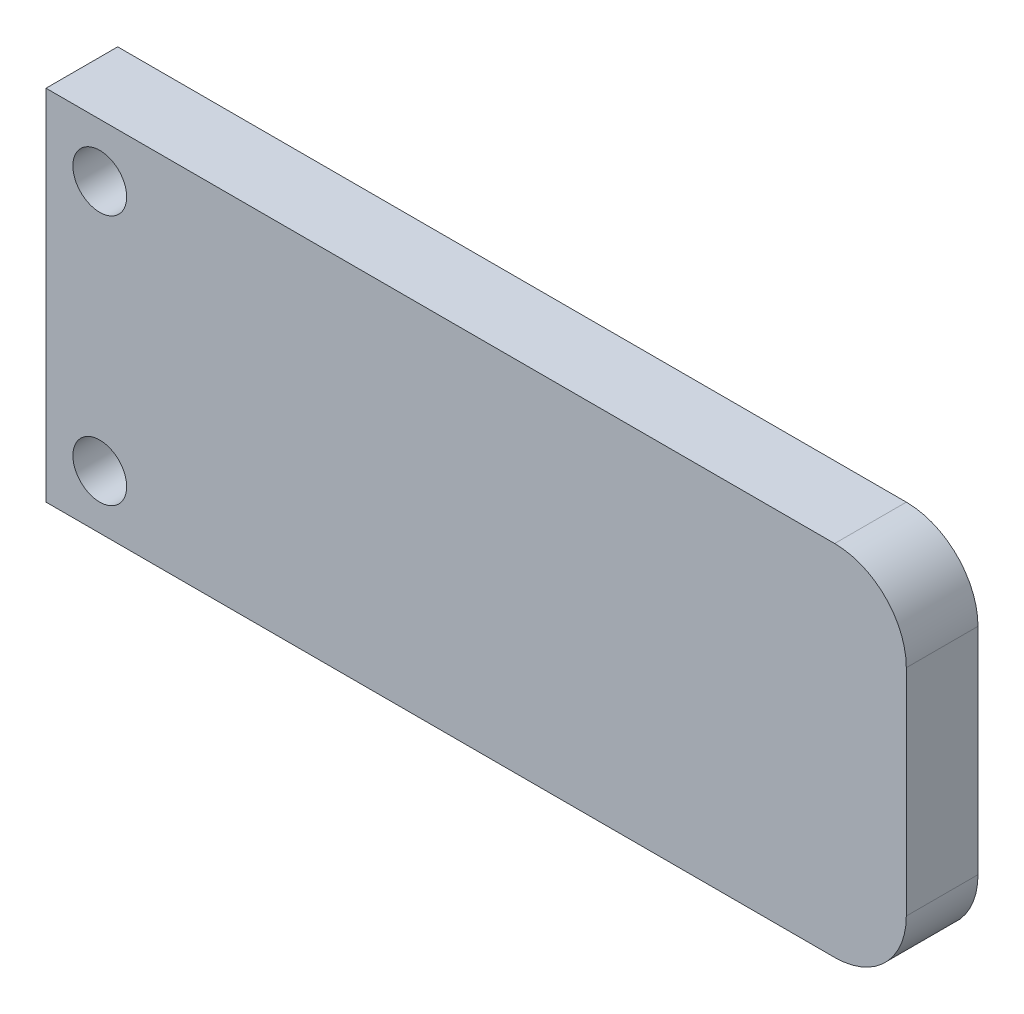
ISO-10303-21;
HEADER;
FILE_DESCRIPTION(('STEP AP214'),'2;1');
FILE_NAME('part.step','',(''),(''),'','','');
FILE_SCHEMA(('AUTOMOTIVE_DESIGN { 1 0 10303 214 1 1 1 1 }'));
ENDSEC;
DATA;
#1=APPLICATION_CONTEXT('core data for automotive mechanical design processes');
#2=APPLICATION_PROTOCOL_DEFINITION('international standard','automotive_design',2000,#1);
#3=PRODUCT_CONTEXT('',#1,'mechanical');
#4=PRODUCT('Part','Part','',(#3));
#5=PRODUCT_RELATED_PRODUCT_CATEGORY('part','',(#4));
#6=PRODUCT_DEFINITION_FORMATION('','',#4);
#7=PRODUCT_DEFINITION_CONTEXT('part definition',#1,'design');
#8=PRODUCT_DEFINITION('design','',#6,#7);
#9=PRODUCT_DEFINITION_SHAPE('','',#8);
#10=(LENGTH_UNIT() NAMED_UNIT(*) SI_UNIT(.MILLI.,.METRE.));
#11=(NAMED_UNIT(*) PLANE_ANGLE_UNIT() SI_UNIT($,.RADIAN.));
#12=(NAMED_UNIT(*) SI_UNIT($,.STERADIAN.) SOLID_ANGLE_UNIT());
#13=UNCERTAINTY_MEASURE_WITH_UNIT(LENGTH_MEASURE(1.E-05),#10,'distance_accuracy_value','');
#14=(GEOMETRIC_REPRESENTATION_CONTEXT(3) GLOBAL_UNCERTAINTY_ASSIGNED_CONTEXT((#13)) GLOBAL_UNIT_ASSIGNED_CONTEXT((#10,
#11,#12)) REPRESENTATION_CONTEXT('',''));
#15=CARTESIAN_POINT('',(0.,0.,0.));
#16=DIRECTION('',(0.,0.,1.));
#17=DIRECTION('',(1.,0.,0.));
#18=AXIS2_PLACEMENT_3D('',#15,#16,#17);
#19=CARTESIAN_POINT('',(24.,-10.,2.));
#20=DIRECTION('',(-1.,0.,0.));
#21=DIRECTION('',(0.,0.,1.));
#22=AXIS2_PLACEMENT_3D('',#19,#20,#21);
#23=PLANE('',#22);
#24=DIRECTION('',(0.,1.,0.));
#25=VECTOR('',#24,1.);
#26=CARTESIAN_POINT('',(24.,-10.,2.));
#27=LINE('',#26,#25);
#28=CARTESIAN_POINT('',(24.,-6.,2.));
#29=VERTEX_POINT('',#28);
#30=CARTESIAN_POINT('',(24.,6.,2.));
#31=VERTEX_POINT('',#30);
#32=EDGE_CURVE('E106',#29,#31,#27,.T.);
#33=ORIENTED_EDGE('',*,*,#32,.F.);
#34=DIRECTION('',(0.,0.,-1.));
#35=VECTOR('',#34,1.);
#36=CARTESIAN_POINT('',(24.,-6.,2.));
#37=LINE('',#36,#35);
#38=CARTESIAN_POINT('',(24.,-6.,-2.));
#39=VERTEX_POINT('',#38);
#40=EDGE_CURVE('E136',#29,#39,#37,.T.);
#41=ORIENTED_EDGE('',*,*,#40,.T.);
#42=DIRECTION('',(0.,1.,0.));
#43=VECTOR('',#42,1.);
#44=CARTESIAN_POINT('',(24.,-10.,-2.));
#45=LINE('',#44,#43);
#46=CARTESIAN_POINT('',(24.,6.,-2.));
#47=VERTEX_POINT('',#46);
#48=EDGE_CURVE('E125',#39,#47,#45,.T.);
#49=ORIENTED_EDGE('',*,*,#48,.T.);
#50=DIRECTION('',(0.,0.,-1.));
#51=VECTOR('',#50,1.);
#52=CARTESIAN_POINT('',(24.,6.,2.));
#53=LINE('',#52,#51);
#54=EDGE_CURVE('E115',#47,#31,#53,.F.);
#55=ORIENTED_EDGE('',*,*,#54,.T.);
#56=EDGE_LOOP('',(#33,#41,#49,#55));
#57=FACE_BOUND('',#56,.T.);
#58=ADVANCED_FACE('F45',(#57),#23,.F.);
#59=CARTESIAN_POINT('',(-24.,10.,2.));
#60=DIRECTION('',(0.,-1.,0.));
#61=DIRECTION('',(0.,0.,-1.));
#62=AXIS2_PLACEMENT_3D('',#59,#60,#61);
#63=PLANE('',#62);
#64=DIRECTION('',(-1.,0.,0.));
#65=VECTOR('',#64,1.);
#66=CARTESIAN_POINT('',(-24.,10.,2.));
#67=LINE('',#66,#65);
#68=CARTESIAN_POINT('',(20.,10.,2.));
#69=VERTEX_POINT('',#68);
#70=CARTESIAN_POINT('',(-24.,10.,2.));
#71=VERTEX_POINT('',#70);
#72=EDGE_CURVE('E98',#69,#71,#67,.T.);
#73=ORIENTED_EDGE('',*,*,#72,.F.);
#74=DIRECTION('',(0.,0.,-1.));
#75=VECTOR('',#74,1.);
#76=CARTESIAN_POINT('',(20.,10.,2.));
#77=LINE('',#76,#75);
#78=CARTESIAN_POINT('',(20.,10.,-2.));
#79=VERTEX_POINT('',#78);
#80=EDGE_CURVE('E11',#69,#79,#77,.T.);
#81=ORIENTED_EDGE('',*,*,#80,.T.);
#82=DIRECTION('',(-1.,0.,0.));
#83=VECTOR('',#82,1.);
#84=CARTESIAN_POINT('',(-24.,10.,-2.));
#85=LINE('',#84,#83);
#86=CARTESIAN_POINT('',(-24.,10.,-2.));
#87=VERTEX_POINT('',#86);
#88=EDGE_CURVE('E112',#79,#87,#85,.T.);
#89=ORIENTED_EDGE('',*,*,#88,.T.);
#90=DIRECTION('',(0.,0.,-1.));
#91=VECTOR('',#90,1.);
#92=CARTESIAN_POINT('',(-24.,10.,2.));
#93=LINE('',#92,#91);
#94=EDGE_CURVE('E109',#71,#87,#93,.T.);
#95=ORIENTED_EDGE('',*,*,#94,.F.);
#96=EDGE_LOOP('',(#73,#81,#89,#95));
#97=FACE_BOUND('',#96,.T.);
#98=ADVANCED_FACE('F110',(#97),#63,.F.);
#99=CARTESIAN_POINT('',(-24.,-10.,2.));
#100=DIRECTION('',(1.,0.,0.));
#101=DIRECTION('',(0.,0.,-1.));
#102=AXIS2_PLACEMENT_3D('',#99,#100,#101);
#103=PLANE('',#102);
#104=DIRECTION('',(0.,-1.,0.));
#105=VECTOR('',#104,1.);
#106=CARTESIAN_POINT('',(-24.,-10.,-2.));
#107=LINE('',#106,#105);
#108=CARTESIAN_POINT('',(-24.,-10.,-2.));
#109=VERTEX_POINT('',#108);
#110=EDGE_CURVE('E130',#87,#109,#107,.T.);
#111=ORIENTED_EDGE('',*,*,#110,.T.);
#112=DIRECTION('',(0.,0.,-1.));
#113=VECTOR('',#112,1.);
#114=CARTESIAN_POINT('',(-24.,-10.,2.));
#115=LINE('',#114,#113);
#116=CARTESIAN_POINT('',(-24.,-10.,2.));
#117=VERTEX_POINT('',#116);
#118=EDGE_CURVE('E116',#117,#109,#115,.T.);
#119=ORIENTED_EDGE('',*,*,#118,.F.);
#120=DIRECTION('',(0.,-1.,0.));
#121=VECTOR('',#120,1.);
#122=CARTESIAN_POINT('',(-24.,-10.,2.));
#123=LINE('',#122,#121);
#124=EDGE_CURVE('E102',#71,#117,#123,.T.);
#125=ORIENTED_EDGE('',*,*,#124,.F.);
#126=ORIENTED_EDGE('',*,*,#94,.T.);
#127=EDGE_LOOP('',(#111,#119,#125,#126));
#128=FACE_BOUND('',#127,.T.);
#129=ADVANCED_FACE('F118',(#128),#103,.F.);
#130=CARTESIAN_POINT('',(-24.,-10.,2.));
#131=DIRECTION('',(0.,1.,0.));
#132=DIRECTION('',(0.,0.,1.));
#133=AXIS2_PLACEMENT_3D('',#130,#131,#132);
#134=PLANE('',#133);
#135=DIRECTION('',(1.,0.,0.));
#136=VECTOR('',#135,1.);
#137=CARTESIAN_POINT('',(-24.,-10.,-2.));
#138=LINE('',#137,#136);
#139=CARTESIAN_POINT('',(20.,-10.,-2.));
#140=VERTEX_POINT('',#139);
#141=EDGE_CURVE('E132',#109,#140,#138,.T.);
#142=ORIENTED_EDGE('',*,*,#141,.T.);
#143=DIRECTION('',(0.,0.,-1.));
#144=VECTOR('',#143,1.);
#145=CARTESIAN_POINT('',(20.,-10.,2.));
#146=LINE('',#145,#144);
#147=CARTESIAN_POINT('',(20.,-10.,2.));
#148=VERTEX_POINT('',#147);
#149=EDGE_CURVE('E68',#140,#148,#146,.F.);
#150=ORIENTED_EDGE('',*,*,#149,.T.);
#151=DIRECTION('',(1.,0.,0.));
#152=VECTOR('',#151,1.);
#153=CARTESIAN_POINT('',(-24.,-10.,2.));
#154=LINE('',#153,#152);
#155=EDGE_CURVE('E120',#117,#148,#154,.T.);
#156=ORIENTED_EDGE('',*,*,#155,.F.);
#157=ORIENTED_EDGE('',*,*,#118,.T.);
#158=EDGE_LOOP('',(#142,#150,#156,#157));
#159=FACE_BOUND('',#158,.T.);
#160=ADVANCED_FACE('F155',(#159),#134,.F.);
#161=CARTESIAN_POINT('',(0.,0.,2.));
#162=DIRECTION('',(0.,0.,-1.));
#163=DIRECTION('',(-1.,0.,0.));
#164=AXIS2_PLACEMENT_3D('',#161,#162,#163);
#165=PLANE('',#164);
#166=CARTESIAN_POINT('',(-21.,7.,2.));
#167=DIRECTION('',(0.,0.,-1.));
#168=DIRECTION('',(-1.,0.,0.));
#169=AXIS2_PLACEMENT_3D('',#166,#167,#168);
#170=CIRCLE('',#169,1.5);
#171=CARTESIAN_POINT('',(-22.5,7.,2.));
#172=VERTEX_POINT('',#171);
#173=EDGE_CURVE('E128',#172,#172,#170,.F.);
#174=ORIENTED_EDGE('',*,*,#173,.F.);
#175=EDGE_LOOP('',(#174));
#176=FACE_BOUND('',#175,.T.);
#177=CARTESIAN_POINT('',(-21.,-7.,2.));
#178=DIRECTION('',(0.,0.,-1.));
#179=DIRECTION('',(-1.,0.,0.));
#180=AXIS2_PLACEMENT_3D('',#177,#178,#179);
#181=CIRCLE('',#180,1.5);
#182=CARTESIAN_POINT('',(-22.5,-7.,2.));
#183=VERTEX_POINT('',#182);
#184=EDGE_CURVE('E199',#183,#183,#181,.F.);
#185=ORIENTED_EDGE('',*,*,#184,.F.);
#186=EDGE_LOOP('',(#185));
#187=FACE_BOUND('',#186,.T.);
#188=ORIENTED_EDGE('',*,*,#155,.T.);
#189=CARTESIAN_POINT('',(20.,-6.,2.));
#190=DIRECTION('',(0.,0.,-1.));
#191=DIRECTION('',(-1.,0.,0.));
#192=AXIS2_PLACEMENT_3D('',#189,#190,#191);
#193=CIRCLE('',#192,4.);
#194=EDGE_CURVE('E53',#148,#29,#193,.F.);
#195=ORIENTED_EDGE('',*,*,#194,.T.);
#196=ORIENTED_EDGE('',*,*,#32,.T.);
#197=CARTESIAN_POINT('',(20.,6.,2.));
#198=DIRECTION('',(0.,0.,-1.));
#199=DIRECTION('',(-1.,0.,0.));
#200=AXIS2_PLACEMENT_3D('',#197,#198,#199);
#201=CIRCLE('',#200,4.);
#202=EDGE_CURVE('E60',#31,#69,#201,.F.);
#203=ORIENTED_EDGE('',*,*,#202,.T.);
#204=ORIENTED_EDGE('',*,*,#72,.T.);
#205=ORIENTED_EDGE('',*,*,#124,.T.);
#206=EDGE_LOOP('',(#188,#195,#196,#203,#204,#205));
#207=FACE_BOUND('',#206,.T.);
#208=ADVANCED_FACE('F100',(#176,#187,#207),#165,.F.);
#209=CARTESIAN_POINT('',(0.,0.,-2.));
#210=DIRECTION('',(0.,0.,-1.));
#211=DIRECTION('',(-1.,0.,0.));
#212=AXIS2_PLACEMENT_3D('',#209,#210,#211);
#213=PLANE('',#212);
#214=CARTESIAN_POINT('',(16.5,0.,-2.));
#215=DIRECTION('',(0.,0.,1.));
#216=DIRECTION('',(-1.,0.,0.));
#217=AXIS2_PLACEMENT_3D('',#214,#215,#216);
#218=CIRCLE('',#217,2.75);
#219=CARTESIAN_POINT('',(13.75,0.,-2.));
#220=VERTEX_POINT('',#219);
#221=EDGE_CURVE('E198',#220,#220,#218,.F.);
#222=ORIENTED_EDGE('',*,*,#221,.F.);
#223=EDGE_LOOP('',(#222));
#224=FACE_BOUND('',#223,.T.);
#225=CARTESIAN_POINT('',(-21.,7.,-2.));
#226=DIRECTION('',(0.,0.,-1.));
#227=DIRECTION('',(-1.,0.,0.));
#228=AXIS2_PLACEMENT_3D('',#225,#226,#227);
#229=CIRCLE('',#228,1.5);
#230=CARTESIAN_POINT('',(-22.5,7.,-2.));
#231=VERTEX_POINT('',#230);
#232=EDGE_CURVE('E205',#231,#231,#229,.T.);
#233=ORIENTED_EDGE('',*,*,#232,.F.);
#234=EDGE_LOOP('',(#233));
#235=FACE_BOUND('',#234,.T.);
#236=CARTESIAN_POINT('',(-21.,-7.,-2.));
#237=DIRECTION('',(0.,0.,-1.));
#238=DIRECTION('',(-1.,0.,0.));
#239=AXIS2_PLACEMENT_3D('',#236,#237,#238);
#240=CIRCLE('',#239,1.5);
#241=CARTESIAN_POINT('',(-22.5,-7.,-2.));
#242=VERTEX_POINT('',#241);
#243=EDGE_CURVE('E202',#242,#242,#240,.T.);
#244=ORIENTED_EDGE('',*,*,#243,.F.);
#245=EDGE_LOOP('',(#244));
#246=FACE_BOUND('',#245,.T.);
#247=ORIENTED_EDGE('',*,*,#48,.F.);
#248=CARTESIAN_POINT('',(20.,-6.,-2.));
#249=DIRECTION('',(0.,0.,-1.));
#250=DIRECTION('',(-1.,0.,0.));
#251=AXIS2_PLACEMENT_3D('',#248,#249,#250);
#252=CIRCLE('',#251,4.);
#253=EDGE_CURVE('E141',#39,#140,#252,.T.);
#254=ORIENTED_EDGE('',*,*,#253,.T.);
#255=ORIENTED_EDGE('',*,*,#141,.F.);
#256=ORIENTED_EDGE('',*,*,#110,.F.);
#257=ORIENTED_EDGE('',*,*,#88,.F.);
#258=CARTESIAN_POINT('',(20.,6.,-2.));
#259=DIRECTION('',(0.,0.,-1.));
#260=DIRECTION('',(-1.,0.,0.));
#261=AXIS2_PLACEMENT_3D('',#258,#259,#260);
#262=CIRCLE('',#261,4.);
#263=EDGE_CURVE('E139',#79,#47,#262,.T.);
#264=ORIENTED_EDGE('',*,*,#263,.T.);
#265=EDGE_LOOP('',(#247,#254,#255,#256,#257,#264));
#266=FACE_BOUND('',#265,.T.);
#267=ADVANCED_FACE('F154',(#224,#235,#246,#266),#213,.T.);
#268=CARTESIAN_POINT('',(20.,-6.,2.));
#269=DIRECTION('',(0.,0.,-1.));
#270=DIRECTION('',(-1.,0.,0.));
#271=AXIS2_PLACEMENT_3D('',#268,#269,#270);
#272=CYLINDRICAL_SURFACE('',#271,4.);
#273=ORIENTED_EDGE('',*,*,#194,.F.);
#274=ORIENTED_EDGE('',*,*,#149,.F.);
#275=ORIENTED_EDGE('',*,*,#253,.F.);
#276=ORIENTED_EDGE('',*,*,#40,.F.);
#277=EDGE_LOOP('',(#273,#274,#275,#276));
#278=FACE_BOUND('',#277,.T.);
#279=ADVANCED_FACE('F151',(#278),#272,.T.);
#280=CARTESIAN_POINT('',(20.,6.,2.));
#281=DIRECTION('',(0.,0.,-1.));
#282=DIRECTION('',(-1.,0.,0.));
#283=AXIS2_PLACEMENT_3D('',#280,#281,#282);
#284=CYLINDRICAL_SURFACE('',#283,4.);
#285=ORIENTED_EDGE('',*,*,#202,.F.);
#286=ORIENTED_EDGE('',*,*,#54,.F.);
#287=ORIENTED_EDGE('',*,*,#263,.F.);
#288=ORIENTED_EDGE('',*,*,#80,.F.);
#289=EDGE_LOOP('',(#285,#286,#287,#288));
#290=FACE_BOUND('',#289,.T.);
#291=ADVANCED_FACE('F47',(#290),#284,.T.);
#292=CARTESIAN_POINT('',(-21.,-7.,2.001));
#293=DIRECTION('',(0.,0.,-1.));
#294=DIRECTION('',(-1.,0.,0.));
#295=AXIS2_PLACEMENT_3D('',#292,#293,#294);
#296=CYLINDRICAL_SURFACE('',#295,1.5);
#297=ORIENTED_EDGE('',*,*,#243,.T.);
#298=EDGE_LOOP('',(#297));
#299=FACE_BOUND('',#298,.T.);
#300=ORIENTED_EDGE('',*,*,#184,.T.);
#301=EDGE_LOOP('',(#300));
#302=FACE_BOUND('',#301,.T.);
#303=ADVANCED_FACE('F177',(#299,#302),#296,.F.);
#304=CARTESIAN_POINT('',(-21.,7.,2.001));
#305=DIRECTION('',(0.,0.,-1.));
#306=DIRECTION('',(-1.,0.,0.));
#307=AXIS2_PLACEMENT_3D('',#304,#305,#306);
#308=CYLINDRICAL_SURFACE('',#307,1.5);
#309=ORIENTED_EDGE('',*,*,#232,.T.);
#310=EDGE_LOOP('',(#309));
#311=FACE_BOUND('',#310,.T.);
#312=ORIENTED_EDGE('',*,*,#173,.T.);
#313=EDGE_LOOP('',(#312));
#314=FACE_BOUND('',#313,.T.);
#315=ADVANCED_FACE('F187',(#311,#314),#308,.F.);
#316=CARTESIAN_POINT('',(16.5,0.,-2.));
#317=DIRECTION('',(1.,0.,0.));
#318=DIRECTION('',(0.,-1.,0.));
#319=AXIS2_PLACEMENT_3D('',#316,#317,#318);
#320=SPHERICAL_SURFACE('',#319,2.75);
#321=CARTESIAN_POINT('',(16.5,0.,-2.));
#322=DIRECTION('',(0.,0.,1.));
#323=DIRECTION('',(-1.,0.,0.));
#324=AXIS2_PLACEMENT_3D('',#321,#322,#323);
#325=SPHERICAL_SURFACE('',#324,2.75);
#326=ORIENTED_EDGE('',*,*,#221,.T.);
#327=EDGE_LOOP('',(#326));
#328=FACE_BOUND('',#327,.T.);
#329=ADVANCED_FACE('F191',(#328),#325,.F.);
#330=CLOSED_SHELL('',(#58,#98,#129,#160,#208,#267,#279,#291,#303,#315,#329));
#331=MANIFOLD_SOLID_BREP('B2',#330);
#332=ADVANCED_BREP_SHAPE_REPRESENTATION('',(#18,#331),#14);
#333=SHAPE_DEFINITION_REPRESENTATION(#9,#332);
ENDSEC;
END-ISO-10303-21;
